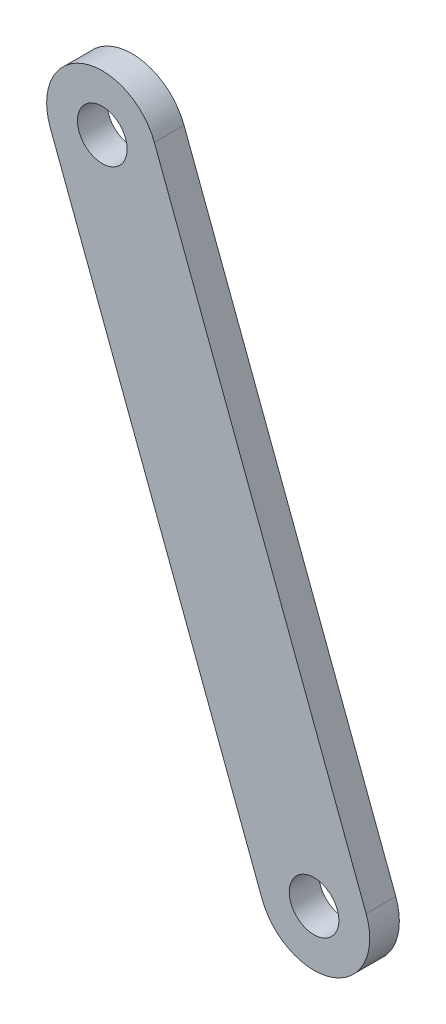
ISO-10303-21;
HEADER;
FILE_DESCRIPTION(('STEP AP214'),'2;1');
FILE_NAME('part.step','',(''),(''),'','','');
FILE_SCHEMA(('AUTOMOTIVE_DESIGN { 1 0 10303 214 1 1 1 1 }'));
ENDSEC;
DATA;
#1=APPLICATION_CONTEXT('core data for automotive mechanical design processes');
#2=APPLICATION_PROTOCOL_DEFINITION('international standard','automotive_design',2000,#1);
#3=PRODUCT_CONTEXT('',#1,'mechanical');
#4=PRODUCT('Part','Part','',(#3));
#5=PRODUCT_RELATED_PRODUCT_CATEGORY('part','',(#4));
#6=PRODUCT_DEFINITION_FORMATION('','',#4);
#7=PRODUCT_DEFINITION_CONTEXT('part definition',#1,'design');
#8=PRODUCT_DEFINITION('design','',#6,#7);
#9=PRODUCT_DEFINITION_SHAPE('','',#8);
#10=(LENGTH_UNIT() NAMED_UNIT(*) SI_UNIT(.MILLI.,.METRE.));
#11=(NAMED_UNIT(*) PLANE_ANGLE_UNIT() SI_UNIT($,.RADIAN.));
#12=(NAMED_UNIT(*) SI_UNIT($,.STERADIAN.) SOLID_ANGLE_UNIT());
#13=UNCERTAINTY_MEASURE_WITH_UNIT(LENGTH_MEASURE(1.E-05),#10,'distance_accuracy_value','');
#14=(GEOMETRIC_REPRESENTATION_CONTEXT(3) GLOBAL_UNCERTAINTY_ASSIGNED_CONTEXT((#13)) GLOBAL_UNIT_ASSIGNED_CONTEXT((#10,
#11,#12)) REPRESENTATION_CONTEXT('',''));
#15=CARTESIAN_POINT('',(0.,0.,0.));
#16=DIRECTION('',(0.,0.,1.));
#17=DIRECTION('',(1.,0.,0.));
#18=AXIS2_PLACEMENT_3D('',#15,#16,#17);
#19=CARTESIAN_POINT('',(952.340536556894,230.532515388699,-19.05));
#20=DIRECTION('',(0.,0.,1.));
#21=DIRECTION('',(1.,0.,0.));
#22=AXIS2_PLACEMENT_3D('',#19,#20,#21);
#23=PLANE('',#22);
#24=CARTESIAN_POINT('',(997.666725337721,110.238094845643,-19.05));
#25=DIRECTION('',(0.,0.,-1.));
#26=DIRECTION('',(-1.,0.,0.));
#27=AXIS2_PLACEMENT_3D('',#24,#25,#26);
#28=CIRCLE('',#27,23.8151475289372);
#29=CARTESIAN_POINT('',(975.381077986436,101.841001660546,-19.05));
#30=VERTEX_POINT('',#29);
#31=CARTESIAN_POINT('',(1019.95237268901,118.63518803074,-19.05));
#32=VERTEX_POINT('',#31);
#33=EDGE_CURVE('E55',#30,#32,#28,.F.);
#34=ORIENTED_EDGE('',*,*,#33,.F.);
#35=DIRECTION('',(0.352594632256382,-0.93577616196609,0.));
#36=VECTOR('',#35,1.);
#37=CARTESIAN_POINT('',(884.728700424781,342.429842746658,-19.05));
#38=LINE('',#37,#36);
#39=CARTESIAN_POINT('',(884.728700424781,342.429842746658,-19.05));
#40=VERTEX_POINT('',#39);
#41=EDGE_CURVE('E60',#40,#30,#38,.T.);
#42=ORIENTED_EDGE('',*,*,#41,.F.);
#43=CARTESIAN_POINT('',(907.014347776066,350.826935931755,-19.05));
#44=DIRECTION('',(0.,0.,-1.));
#45=DIRECTION('',(-1.,0.,0.));
#46=AXIS2_PLACEMENT_3D('',#43,#44,#45);
#47=CIRCLE('',#46,23.8151475289372);
#48=CARTESIAN_POINT('',(929.299995127351,359.224029116852,-19.05));
#49=VERTEX_POINT('',#48);
#50=EDGE_CURVE('E73',#49,#40,#47,.F.);
#51=ORIENTED_EDGE('',*,*,#50,.F.);
#52=DIRECTION('',(-0.352594632256382,0.93577616196609,0.));
#53=VECTOR('',#52,1.);
#54=CARTESIAN_POINT('',(1019.95237268901,118.63518803074,-19.05));
#55=LINE('',#54,#53);
#56=EDGE_CURVE('E61',#32,#49,#55,.T.);
#57=ORIENTED_EDGE('',*,*,#56,.F.);
#58=EDGE_LOOP('',(#34,#42,#51,#57));
#59=FACE_BOUND('',#58,.T.);
#60=CARTESIAN_POINT('',(907.014347776066,350.826935931755,-19.05));
#61=DIRECTION('',(0.,0.,-1.));
#62=DIRECTION('',(-1.,0.,0.));
#63=AXIS2_PLACEMENT_3D('',#60,#61,#62);
#64=CIRCLE('',#63,10.6212965715647);
#65=CARTESIAN_POINT('',(896.393051204501,350.826935931755,-19.05));
#66=VERTEX_POINT('',#65);
#67=EDGE_CURVE('E65',#66,#66,#64,.T.);
#68=ORIENTED_EDGE('',*,*,#67,.F.);
#69=EDGE_LOOP('',(#68));
#70=FACE_BOUND('',#69,.T.);
#71=CARTESIAN_POINT('',(997.666725337721,110.238094845643,-19.05));
#72=DIRECTION('',(0.,0.,-1.));
#73=DIRECTION('',(-1.,0.,0.));
#74=AXIS2_PLACEMENT_3D('',#71,#72,#73);
#75=CIRCLE('',#74,10.6212965715647);
#76=CARTESIAN_POINT('',(987.045428766157,110.238094845643,-19.05));
#77=VERTEX_POINT('',#76);
#78=EDGE_CURVE('E19',#77,#77,#75,.T.);
#79=ORIENTED_EDGE('',*,*,#78,.F.);
#80=EDGE_LOOP('',(#79));
#81=FACE_BOUND('',#80,.T.);
#82=ADVANCED_FACE('F16',(#59,#70,#81),#23,.F.);
#83=CARTESIAN_POINT('',(997.666725337721,110.238094845643,-6.35));
#84=DIRECTION('',(0.,0.,-1.));
#85=DIRECTION('',(-1.,0.,0.));
#86=AXIS2_PLACEMENT_3D('',#83,#84,#85);
#87=CYLINDRICAL_SURFACE('',#86,10.6212965715647);
#88=CARTESIAN_POINT('',(997.666725337721,110.238094845643,-6.35));
#89=DIRECTION('',(0.,0.,-1.));
#90=DIRECTION('',(-1.,0.,0.));
#91=AXIS2_PLACEMENT_3D('',#88,#89,#90);
#92=CIRCLE('',#91,10.6212965715647);
#93=CARTESIAN_POINT('',(987.045428766157,110.238094845643,-6.35));
#94=VERTEX_POINT('',#93);
#95=EDGE_CURVE('E76',#94,#94,#92,.T.);
#96=ORIENTED_EDGE('',*,*,#95,.F.);
#97=EDGE_LOOP('',(#96));
#98=FACE_BOUND('',#97,.T.);
#99=ORIENTED_EDGE('',*,*,#78,.T.);
#100=EDGE_LOOP('',(#99));
#101=FACE_BOUND('',#100,.T.);
#102=ADVANCED_FACE('F99',(#98,#101),#87,.F.);
#103=CARTESIAN_POINT('',(907.014347776066,350.826935931755,-6.35));
#104=DIRECTION('',(0.,0.,-1.));
#105=DIRECTION('',(-1.,0.,0.));
#106=AXIS2_PLACEMENT_3D('',#103,#104,#105);
#107=CYLINDRICAL_SURFACE('',#106,10.6212965715647);
#108=CARTESIAN_POINT('',(907.014347776066,350.826935931755,-6.35));
#109=DIRECTION('',(0.,0.,-1.));
#110=DIRECTION('',(-1.,0.,0.));
#111=AXIS2_PLACEMENT_3D('',#108,#109,#110);
#112=CIRCLE('',#111,10.6212965715647);
#113=CARTESIAN_POINT('',(896.393051204501,350.826935931755,-6.35));
#114=VERTEX_POINT('',#113);
#115=EDGE_CURVE('E79',#114,#114,#112,.T.);
#116=ORIENTED_EDGE('',*,*,#115,.F.);
#117=EDGE_LOOP('',(#116));
#118=FACE_BOUND('',#117,.T.);
#119=ORIENTED_EDGE('',*,*,#67,.T.);
#120=EDGE_LOOP('',(#119));
#121=FACE_BOUND('',#120,.T.);
#122=ADVANCED_FACE('F106',(#118,#121),#107,.F.);
#123=CARTESIAN_POINT('',(997.666725337721,110.238094845643,-6.35));
#124=DIRECTION('',(0.,0.,-1.));
#125=DIRECTION('',(-1.,0.,0.));
#126=AXIS2_PLACEMENT_3D('',#123,#124,#125);
#127=CYLINDRICAL_SURFACE('',#126,23.8151475289372);
#128=DIRECTION('',(0.,0.,1.));
#129=VECTOR('',#128,1.);
#130=CARTESIAN_POINT('',(975.381077986436,101.841001660546,-6.35));
#131=LINE('',#130,#129);
#132=CARTESIAN_POINT('',(975.381077986436,101.841001660546,-6.35));
#133=VERTEX_POINT('',#132);
#134=EDGE_CURVE('E68',#30,#133,#131,.T.);
#135=ORIENTED_EDGE('',*,*,#134,.F.);
#136=ORIENTED_EDGE('',*,*,#33,.T.);
#137=DIRECTION('',(0.,0.,1.));
#138=VECTOR('',#137,1.);
#139=CARTESIAN_POINT('',(1019.95237268901,118.63518803074,-6.35));
#140=LINE('',#139,#138);
#141=CARTESIAN_POINT('',(1019.95237268901,118.63518803074,-6.35));
#142=VERTEX_POINT('',#141);
#143=EDGE_CURVE('E64',#142,#32,#140,.F.);
#144=ORIENTED_EDGE('',*,*,#143,.F.);
#145=CARTESIAN_POINT('',(997.666725337721,110.238094845643,-6.35));
#146=DIRECTION('',(0.,0.,-1.));
#147=DIRECTION('',(-1.,0.,0.));
#148=AXIS2_PLACEMENT_3D('',#145,#146,#147);
#149=CIRCLE('',#148,23.8151475289372);
#150=EDGE_CURVE('E71',#133,#142,#149,.F.);
#151=ORIENTED_EDGE('',*,*,#150,.F.);
#152=EDGE_LOOP('',(#135,#136,#144,#151));
#153=FACE_BOUND('',#152,.T.);
#154=ADVANCED_FACE('F69',(#153),#127,.T.);
#155=CARTESIAN_POINT('',(1019.95237268901,118.63518803074,-6.35));
#156=DIRECTION('',(0.93577616196609,0.352594632256382,0.));
#157=DIRECTION('',(-0.352594632256382,0.93577616196609,0.));
#158=AXIS2_PLACEMENT_3D('',#155,#156,#157);
#159=PLANE('',#158);
#160=ORIENTED_EDGE('',*,*,#143,.T.);
#161=ORIENTED_EDGE('',*,*,#56,.T.);
#162=DIRECTION('',(0.,0.,-1.));
#163=VECTOR('',#162,1.);
#164=CARTESIAN_POINT('',(929.299995127351,359.224029116852,-6.35));
#165=LINE('',#164,#163);
#166=CARTESIAN_POINT('',(929.299995127351,359.224029116852,-6.35));
#167=VERTEX_POINT('',#166);
#168=EDGE_CURVE('E86',#167,#49,#165,.T.);
#169=ORIENTED_EDGE('',*,*,#168,.F.);
#170=DIRECTION('',(-0.352594632256382,0.935776161966091,0.));
#171=VECTOR('',#170,1.);
#172=CARTESIAN_POINT('',(1019.95237268901,118.63518803074,-6.35));
#173=LINE('',#172,#171);
#174=EDGE_CURVE('E89',#142,#167,#173,.T.);
#175=ORIENTED_EDGE('',*,*,#174,.F.);
#176=EDGE_LOOP('',(#160,#161,#169,#175));
#177=FACE_BOUND('',#176,.T.);
#178=ADVANCED_FACE('F121',(#177),#159,.T.);
#179=CARTESIAN_POINT('',(907.014347776066,350.826935931755,-6.35));
#180=DIRECTION('',(0.,0.,-1.));
#181=DIRECTION('',(-1.,0.,0.));
#182=AXIS2_PLACEMENT_3D('',#179,#180,#181);
#183=CYLINDRICAL_SURFACE('',#182,23.8151475289372);
#184=ORIENTED_EDGE('',*,*,#168,.T.);
#185=ORIENTED_EDGE('',*,*,#50,.T.);
#186=DIRECTION('',(0.,0.,1.));
#187=VECTOR('',#186,1.);
#188=CARTESIAN_POINT('',(884.728700424781,342.429842746658,-6.35));
#189=LINE('',#188,#187);
#190=CARTESIAN_POINT('',(884.728700424781,342.429842746658,-6.35));
#191=VERTEX_POINT('',#190);
#192=EDGE_CURVE('E34',#191,#40,#189,.F.);
#193=ORIENTED_EDGE('',*,*,#192,.F.);
#194=CARTESIAN_POINT('',(907.014347776066,350.826935931755,-6.35));
#195=DIRECTION('',(0.,0.,-1.));
#196=DIRECTION('',(-1.,0.,0.));
#197=AXIS2_PLACEMENT_3D('',#194,#195,#196);
#198=CIRCLE('',#197,23.8151475289372);
#199=EDGE_CURVE('E25',#167,#191,#198,.F.);
#200=ORIENTED_EDGE('',*,*,#199,.F.);
#201=EDGE_LOOP('',(#184,#185,#193,#200));
#202=FACE_BOUND('',#201,.T.);
#203=ADVANCED_FACE('F115',(#202),#183,.T.);
#204=CARTESIAN_POINT('',(884.728700424781,342.429842746658,-6.35));
#205=DIRECTION('',(-0.93577616196609,-0.352594632256382,0.));
#206=DIRECTION('',(0.352594632256382,-0.93577616196609,0.));
#207=AXIS2_PLACEMENT_3D('',#204,#205,#206);
#208=PLANE('',#207);
#209=ORIENTED_EDGE('',*,*,#192,.T.);
#210=ORIENTED_EDGE('',*,*,#41,.T.);
#211=ORIENTED_EDGE('',*,*,#134,.T.);
#212=DIRECTION('',(0.352594632256382,-0.93577616196609,0.));
#213=VECTOR('',#212,1.);
#214=CARTESIAN_POINT('',(884.728700424781,342.429842746658,-6.35));
#215=LINE('',#214,#213);
#216=EDGE_CURVE('E10',#191,#133,#215,.T.);
#217=ORIENTED_EDGE('',*,*,#216,.F.);
#218=EDGE_LOOP('',(#209,#210,#211,#217));
#219=FACE_BOUND('',#218,.T.);
#220=ADVANCED_FACE('F75',(#219),#208,.T.);
#221=CARTESIAN_POINT('',(952.340536556894,230.532515388699,-6.35));
#222=DIRECTION('',(0.,0.,1.));
#223=DIRECTION('',(1.,0.,0.));
#224=AXIS2_PLACEMENT_3D('',#221,#222,#223);
#225=PLANE('',#224);
#226=ORIENTED_EDGE('',*,*,#199,.T.);
#227=ORIENTED_EDGE('',*,*,#216,.T.);
#228=ORIENTED_EDGE('',*,*,#150,.T.);
#229=ORIENTED_EDGE('',*,*,#174,.T.);
#230=EDGE_LOOP('',(#226,#227,#228,#229));
#231=FACE_BOUND('',#230,.T.);
#232=ORIENTED_EDGE('',*,*,#115,.T.);
#233=EDGE_LOOP('',(#232));
#234=FACE_BOUND('',#233,.T.);
#235=ORIENTED_EDGE('',*,*,#95,.T.);
#236=EDGE_LOOP('',(#235));
#237=FACE_BOUND('',#236,.T.);
#238=ADVANCED_FACE('F108',(#231,#234,#237),#225,.T.);
#239=CLOSED_SHELL('',(#82,#102,#122,#154,#178,#203,#220,#238));
#240=MANIFOLD_SOLID_BREP('B1',#239);
#241=ADVANCED_BREP_SHAPE_REPRESENTATION('',(#18,#240),#14);
#242=SHAPE_DEFINITION_REPRESENTATION(#9,#241);
ENDSEC;
END-ISO-10303-21;
